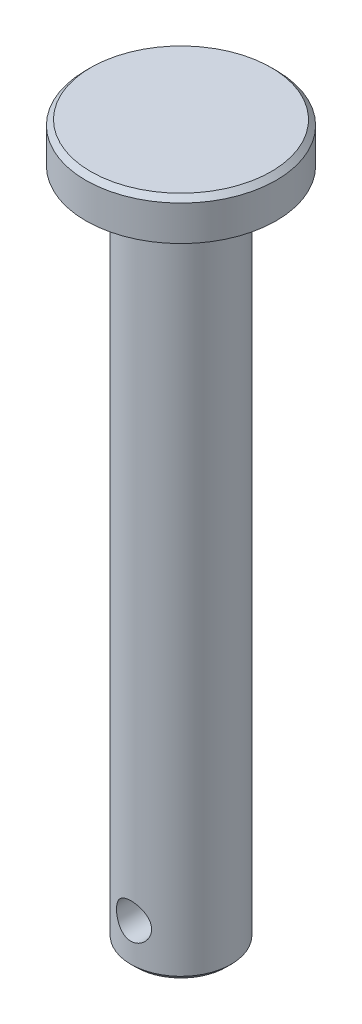
ISO-10303-21;
HEADER;
FILE_DESCRIPTION(('STEP AP214'),'2;1');
FILE_NAME('part.step','',(''),(''),'','','');
FILE_SCHEMA(('AUTOMOTIVE_DESIGN { 1 0 10303 214 1 1 1 1 }'));
ENDSEC;
DATA;
#1=APPLICATION_CONTEXT('core data for automotive mechanical design processes');
#2=APPLICATION_PROTOCOL_DEFINITION('international standard','automotive_design',2000,#1);
#3=PRODUCT_CONTEXT('',#1,'mechanical');
#4=PRODUCT('Part','Part','',(#3));
#5=PRODUCT_RELATED_PRODUCT_CATEGORY('part','',(#4));
#6=PRODUCT_DEFINITION_FORMATION('','',#4);
#7=PRODUCT_DEFINITION_CONTEXT('part definition',#1,'design');
#8=PRODUCT_DEFINITION('design','',#6,#7);
#9=PRODUCT_DEFINITION_SHAPE('','',#8);
#10=(LENGTH_UNIT() NAMED_UNIT(*) SI_UNIT(.MILLI.,.METRE.));
#11=(NAMED_UNIT(*) PLANE_ANGLE_UNIT() SI_UNIT($,.RADIAN.));
#12=(NAMED_UNIT(*) SI_UNIT($,.STERADIAN.) SOLID_ANGLE_UNIT());
#13=UNCERTAINTY_MEASURE_WITH_UNIT(LENGTH_MEASURE(1.E-05),#10,'distance_accuracy_value','');
#14=(GEOMETRIC_REPRESENTATION_CONTEXT(3) GLOBAL_UNCERTAINTY_ASSIGNED_CONTEXT((#13)) GLOBAL_UNIT_ASSIGNED_CONTEXT((#10,
#11,#12)) REPRESENTATION_CONTEXT('',''));
#15=CARTESIAN_POINT('',(0.,0.,0.));
#16=DIRECTION('',(0.,0.,1.));
#17=DIRECTION('',(1.,0.,0.));
#18=AXIS2_PLACEMENT_3D('',#15,#16,#17);
#19=CARTESIAN_POINT('',(0.,71.,0.));
#20=DIRECTION('',(0.,-1.,0.));
#21=DIRECTION('',(0.,0.,-1.));
#22=AXIS2_PLACEMENT_3D('',#19,#20,#21);
#23=PLANE('',#22);
#24=CARTESIAN_POINT('',(0.,71.,0.));
#25=DIRECTION('',(0.,1.,0.));
#26=DIRECTION('',(0.,0.,1.));
#27=AXIS2_PLACEMENT_3D('',#24,#25,#26);
#28=CIRCLE('',#27,18.);
#29=CARTESIAN_POINT('',(0.,71.,18.));
#30=VERTEX_POINT('',#29);
#31=EDGE_CURVE('E10',#30,#30,#28,.T.);
#32=ORIENTED_EDGE('',*,*,#31,.T.);
#33=EDGE_LOOP('',(#32));
#34=FACE_BOUND('',#33,.T.);
#35=ADVANCED_FACE('F37',(#34),#23,.F.);
#36=CARTESIAN_POINT('',(0.,70.,0.));
#37=DIRECTION('',(0.,-1.,0.));
#38=DIRECTION('',(0.,0.,-1.));
#39=AXIS2_PLACEMENT_3D('',#36,#37,#38);
#40=CONICAL_SURFACE('',#39,19.,0.785398163397455);
#41=ORIENTED_EDGE('',*,*,#31,.F.);
#42=EDGE_LOOP('',(#41));
#43=FACE_BOUND('',#42,.T.);
#44=CARTESIAN_POINT('',(0.,70.,0.));
#45=DIRECTION('',(0.,1.,0.));
#46=DIRECTION('',(0.,0.,1.));
#47=AXIS2_PLACEMENT_3D('',#44,#45,#46);
#48=CIRCLE('',#47,19.);
#49=CARTESIAN_POINT('',(0.,70.,19.));
#50=VERTEX_POINT('',#49);
#51=EDGE_CURVE('E49',#50,#50,#48,.T.);
#52=ORIENTED_EDGE('',*,*,#51,.T.);
#53=EDGE_LOOP('',(#52));
#54=FACE_BOUND('',#53,.T.);
#55=ADVANCED_FACE('F87',(#43,#54),#40,.T.);
#56=CARTESIAN_POINT('',(0.,71.,0.));
#57=DIRECTION('',(0.,1.,0.));
#58=DIRECTION('',(0.,0.,1.));
#59=AXIS2_PLACEMENT_3D('',#56,#57,#58);
#60=CYLINDRICAL_SURFACE('',#59,19.);
#61=ORIENTED_EDGE('',*,*,#51,.F.);
#62=EDGE_LOOP('',(#61));
#63=FACE_BOUND('',#62,.T.);
#64=CARTESIAN_POINT('',(0.,63.,0.));
#65=DIRECTION('',(0.,1.,0.));
#66=DIRECTION('',(0.,0.,1.));
#67=AXIS2_PLACEMENT_3D('',#64,#65,#66);
#68=CIRCLE('',#67,19.);
#69=CARTESIAN_POINT('',(0.,63.,19.));
#70=VERTEX_POINT('',#69);
#71=EDGE_CURVE('E54',#70,#70,#68,.T.);
#72=ORIENTED_EDGE('',*,*,#71,.T.);
#73=EDGE_LOOP('',(#72));
#74=FACE_BOUND('',#73,.T.);
#75=ADVANCED_FACE('F91',(#63,#74),#60,.T.);
#76=CARTESIAN_POINT('',(0.,63.,-19.));
#77=DIRECTION('',(0.,1.,0.));
#78=DIRECTION('',(0.,0.,1.));
#79=AXIS2_PLACEMENT_3D('',#76,#77,#78);
#80=PLANE('',#79);
#81=ORIENTED_EDGE('',*,*,#71,.F.);
#82=EDGE_LOOP('',(#81));
#83=FACE_BOUND('',#82,.T.);
#84=CARTESIAN_POINT('',(0.,63.,0.));
#85=DIRECTION('',(0.,1.,0.));
#86=DIRECTION('',(0.,0.,1.));
#87=AXIS2_PLACEMENT_3D('',#84,#85,#86);
#88=CIRCLE('',#87,9.99999999999998);
#89=CARTESIAN_POINT('',(0.,63.,9.99999999999997));
#90=VERTEX_POINT('',#89);
#91=EDGE_CURVE('E107',#90,#90,#88,.T.);
#92=ORIENTED_EDGE('',*,*,#91,.T.);
#93=EDGE_LOOP('',(#92));
#94=FACE_BOUND('',#93,.T.);
#95=ADVANCED_FACE('F82',(#83,#94),#80,.F.);
#96=CARTESIAN_POINT('',(0.,71.,0.));
#97=DIRECTION('',(0.,1.,0.));
#98=DIRECTION('',(0.,0.,1.));
#99=AXIS2_PLACEMENT_3D('',#96,#97,#98);
#100=CYLINDRICAL_SURFACE('',#99,9.99999999999999);
#101=CARTESIAN_POINT('',(0.,-66.,9.99999999999997));
#102=CARTESIAN_POINT('',(-0.190419365667704,-66.0000029566494,10.000002074662));
#103=CARTESIAN_POINT('',(-0.380817621605742,-65.9844103285946,9.99451197787142));
#104=CARTESIAN_POINT('',(-0.75597335916891,-65.9226662068378,9.97315454250191));
#105=CARTESIAN_POINT('',(-0.940730815616033,-65.8765145767548,9.95728715761049));
#106=CARTESIAN_POINT('',(-1.29914235601609,-65.755451061498,9.91689126922361));
#107=CARTESIAN_POINT('',(-1.47281549375809,-65.6805901702276,9.89237812863978));
#108=CARTESIAN_POINT('',(-1.80513664529484,-65.504474888736,9.83716899731451));
#109=CARTESIAN_POINT('',(-1.96378123246314,-65.4032144988767,9.8064716014795));
#110=CARTESIAN_POINT('',(-2.26752589205325,-65.1731714843493,9.74080617360302));
#111=CARTESIAN_POINT('',(-2.4119819647604,-65.0435700817775,9.70572841777003));
#112=CARTESIAN_POINT('',(-2.67761185151263,-64.7622633310526,9.63583394944017));
#113=CARTESIAN_POINT('',(-2.79877980873017,-64.610552439313,9.6010173047214));
#114=CARTESIAN_POINT('',(-3.01822956436078,-64.2833453504412,9.53435354213096));
#115=CARTESIAN_POINT('',(-3.11564633061597,-64.1072394415403,9.50263856119574));
#116=CARTESIAN_POINT('',(-3.27919932284536,-63.7398554097092,9.44745244346255));
#117=CARTESIAN_POINT('',(-3.34534622118705,-63.5485824893256,9.4239784947154));
#118=CARTESIAN_POINT('',(-3.442016393275,-63.1636569673167,9.38909436352037));
#119=CARTESIAN_POINT('',(-3.47375567154242,-62.9703481028578,9.37727382728345));
#120=CARTESIAN_POINT('',(-3.5045119777418,-62.5808148810861,9.36582571885874));
#121=CARTESIAN_POINT('',(-3.50354037655207,-62.3845915605982,9.36619390965383));
#122=CARTESIAN_POINT('',(-3.46984099899521,-62.0054505410864,9.37872426808733));
#123=CARTESIAN_POINT('',(-3.43873715098197,-61.8223650196226,9.39028330321837));
#124=CARTESIAN_POINT('',(-3.34831908308157,-61.4641975936172,9.42290004435311));
#125=CARTESIAN_POINT('',(-3.2890011577967,-61.2891167436529,9.44395899797682));
#126=CARTESIAN_POINT('',(-3.14284371093641,-60.9483876332511,9.49360610743062));
#127=CARTESIAN_POINT('',(-3.05554665446728,-60.7829544486595,9.52231799264174));
#128=CARTESIAN_POINT('',(-2.85622688502669,-60.4685880510071,9.58398812877149));
#129=CARTESIAN_POINT('',(-2.74419646122598,-60.3196600053538,9.61694770260494));
#130=CARTESIAN_POINT('',(-2.49093399518727,-60.0334567716329,9.68573241314922));
#131=CARTESIAN_POINT('',(-2.34838607842094,-59.8973567504519,9.72161293244869));
#132=CARTESIAN_POINT('',(-2.04205684725532,-59.6506701281103,9.79053740803574));
#133=CARTESIAN_POINT('',(-1.87827306050323,-59.5400865018292,9.82358103329668));
#134=CARTESIAN_POINT('',(-1.53143472911855,-59.346494008746,9.88362313366386));
#135=CARTESIAN_POINT('',(-1.34817380341042,-59.2638294375549,9.91054487994603));
#136=CARTESIAN_POINT('',(-0.969175142974263,-59.1308776931334,9.95474882353581));
#137=CARTESIAN_POINT('',(-0.773442238836896,-59.0805780672284,9.97203472796903));
#138=CARTESIAN_POINT('',(-0.384982043681422,-59.0159341865782,9.99439060162867));
#139=CARTESIAN_POINT('',(-0.192549298627004,-59.0000041934811,9.99999889165428));
#140=CARTESIAN_POINT('',(0.192296486438432,-58.9999958106579,10.0000011069648));
#141=CARTESIAN_POINT('',(0.38470952331625,-59.0159114114297,9.99439714808518));
#142=CARTESIAN_POINT('',(0.757512294713572,-59.0779053499036,9.97296032320397));
#143=CARTESIAN_POINT('',(0.938089527398882,-59.1229851377336,9.95746630824308));
#144=CARTESIAN_POINT('',(1.28902504417687,-59.2407538149005,9.91814590109249));
#145=CARTESIAN_POINT('',(1.45938200269866,-59.3134462766792,9.89431843077796));
#146=CARTESIAN_POINT('',(1.790306794606,-59.4865900886315,9.83990425287677));
#147=CARTESIAN_POINT('',(1.95047324127449,-59.5877539847035,9.80914873431525));
#148=CARTESIAN_POINT('',(2.25205778758365,-59.8141451795731,9.74433517467016));
#149=CARTESIAN_POINT('',(2.39346963572598,-59.9393804682239,9.71027603890406));
#150=CARTESIAN_POINT('',(2.66095315380392,-60.2178002016141,9.64050839724204));
#151=CARTESIAN_POINT('',(2.7858945116179,-60.3720741079768,9.60480315581243));
#152=CARTESIAN_POINT('',(3.00828742625727,-60.7001458993998,9.53749178690691));
#153=CARTESIAN_POINT('',(3.10573801857335,-60.8739444691809,9.50588580327386));
#154=CARTESIAN_POINT('',(3.27010981479248,-61.2366672902075,9.45060554949469));
#155=CARTESIAN_POINT('',(3.33703039732226,-61.4255918492183,9.42693144078759));
#156=CARTESIAN_POINT('',(3.43775166187451,-61.8130654538863,9.39067542064748));
#157=CARTESIAN_POINT('',(3.47156933803391,-62.0116095061532,9.3780878180351));
#158=CARTESIAN_POINT('',(3.50371939295706,-62.4006203215422,9.36612061036571));
#159=CARTESIAN_POINT('',(3.50394730780741,-62.5909102966854,9.3660354680114));
#160=CARTESIAN_POINT('',(3.47365100022854,-62.9686626231576,9.37731326834124));
#161=CARTESIAN_POINT('',(3.44312898727853,-63.1561251766635,9.3886753885035));
#162=CARTESIAN_POINT('',(3.35359653138477,-63.5185509587428,9.42101694008898));
#163=CARTESIAN_POINT('',(3.29526105722089,-63.6937029666805,9.44176794542045));
#164=CARTESIAN_POINT('',(3.15232119578642,-64.0318580948069,9.49044489662162));
#165=CARTESIAN_POINT('',(3.0677106267727,-64.1948583448482,9.51837253067018));
#166=CARTESIAN_POINT('',(2.86997020698607,-64.5124345753923,9.57989875691139));
#167=CARTESIAN_POINT('',(2.75568240723705,-64.6662494002015,9.61370284993342));
#168=CARTESIAN_POINT('',(2.50372401134065,-64.9531276286835,9.68237561466641));
#169=CARTESIAN_POINT('',(2.36604648644048,-65.086184860852,9.71724459931304));
#170=CARTESIAN_POINT('',(2.06385316503681,-65.333783781714,9.78598669527178));
#171=CARTESIAN_POINT('',(1.89841397862824,-65.4472344505094,9.81974595569708));
#172=CARTESIAN_POINT('',(1.54966762908333,-65.6446234952796,9.88078026171567));
#173=CARTESIAN_POINT('',(1.36636283652995,-65.7285657799237,9.90805616593675));
#174=CARTESIAN_POINT('',(0.989029837726606,-65.8632572190412,9.95276281016495));
#175=CARTESIAN_POINT('',(0.795139546253175,-65.9143566085701,9.97029715080658));
#176=CARTESIAN_POINT('',(0.400823491605337,-65.9827204850051,9.99391263716037));
#177=CARTESIAN_POINT('',(0.200400055490112,-65.99999688838,9.99999781659607));
#178=CARTESIAN_POINT('',(0.,-66.,9.99999999999997));
#179=B_SPLINE_CURVE_WITH_KNOTS('',3,(#101,#102,#103,#104,#105,#106,#107,#108,#109,#110,#111,
#112,#113,#114,#115,#116,#117,#118,#119,#120,#121,#122,#123,#124,#125,#126,#127,#128,#129,#130,
#131,#132,#133,#134,#135,#136,#137,#138,#139,#140,#141,#142,#143,#144,#145,#146,#147,#148,#149,
#150,#151,#152,#153,#154,#155,#156,#157,#158,#159,#160,#161,#162,#163,#164,#165,#166,#167,#168,
#169,#170,#171,#172,#173,#174,#175,#176,#177,#178),.UNSPECIFIED.,.T.,.F.,(4,2,2,2,2,2,2,2,2,2,2,
2,2,2,2,2,2,2,2,2,2,2,2,2,2,2,2,2,2,2,2,2,2,2,2,2,2,2,4),(0.,0.570519944031419,1.14104243423655,
1.71055621088201,2.28019953012127,2.86921290102947,3.45837421214187,4.06655384480434,
4.67452575637786,5.26023033916309,5.84573132281353,6.40133800538016,6.95701767677413,
7.52229238004191,8.08774356179834,8.68595781382782,9.28424177465472,9.88965514245498,
10.4948354330496,11.0714375543579,11.6479308767879,12.2056613710878,12.7634640474099,
13.336703777142,13.9101341080364,14.5124257563886,15.1147385334242,15.7170635687055,
16.319079224177,16.8871081579754,17.4550962800157,18.0099524936405,18.5649393473461,
19.1461307089424,19.7274945383823,20.3347978040911,20.9420205963009,21.542655573071,
22.1430788968291),.UNSPECIFIED.);
#180=CARTESIAN_POINT('',(0.,-66.,9.99999999999997));
#181=VERTEX_POINT('',#180);
#182=EDGE_CURVE('E40',#181,#181,#179,.T.);
#183=ORIENTED_EDGE('',*,*,#182,.T.);
#184=EDGE_LOOP('',(#183));
#185=FACE_BOUND('',#184,.T.);
#186=CARTESIAN_POINT('',(3.5,-62.5,-9.3674969975976));
#187=CARTESIAN_POINT('',(3.50000305653412,-62.3099847715568,-9.36749440971919));
#188=CARTESIAN_POINT('',(3.48447405691784,-62.1199908337182,-9.37334161385506));
#189=CARTESIAN_POINT('',(3.42300568686183,-61.745670773122,-9.3959610792646));
#190=CARTESIAN_POINT('',(3.37706378968547,-61.5613451226235,-9.41273424827747));
#191=CARTESIAN_POINT('',(3.25661257103421,-61.2038533163906,-9.45507797616443));
#192=CARTESIAN_POINT('',(3.18216395043216,-61.0306643556949,-9.48062983032267));
#193=CARTESIAN_POINT('',(3.00702321848338,-60.6991732325953,-9.53762356429099));
#194=CARTESIAN_POINT('',(2.90632443475546,-60.5408748690902,-9.56906694106175));
#195=CARTESIAN_POINT('',(2.67688293965062,-60.2368213832174,-9.63582342492187));
#196=CARTESIAN_POINT('',(2.54719487518731,-60.0918021561627,-9.67123996185276));
#197=CARTESIAN_POINT('',(2.26546916251154,-59.8250625059667,-9.74108253834275));
#198=CARTESIAN_POINT('',(2.11342750418821,-59.7033462722917,-9.77550839885223));
#199=CARTESIAN_POINT('',(1.78585018605226,-59.4832498710801,-9.84070055714599));
#200=CARTESIAN_POINT('',(1.60975957407365,-59.3856519099238,-9.87133119900492));
#201=CARTESIAN_POINT('',(1.2424014342135,-59.2217603822514,-9.92425360244259));
#202=CARTESIAN_POINT('',(1.05113846528144,-59.1554574535921,-9.94654785749863));
#203=CARTESIAN_POINT('',(0.666588882256228,-59.0585664225236,-9.97955234395668));
#204=CARTESIAN_POINT('',(0.473656238100813,-59.0267152549479,-9.99067110510591));
#205=CARTESIAN_POINT('',(0.0848856021438209,-58.9956038246808,-10.0015281495066));
#206=CARTESIAN_POINT('',(-0.110951549876001,-58.9963343184449,-10.0012696605286));
#207=CARTESIAN_POINT('',(-0.490988541369923,-59.0295896163455,-9.98967164690015));
#208=CARTESIAN_POINT('',(-0.675325714390917,-59.0607400303382,-9.97881113553875));
#209=CARTESIAN_POINT('',(-1.03596846192583,-59.1516630279226,-9.9478411735745));
#210=CARTESIAN_POINT('',(-1.21227347889997,-59.211437595111,-9.92773108199803));
#211=CARTESIAN_POINT('',(-1.55471483181771,-59.3586493032111,-9.87993869693849));
#212=CARTESIAN_POINT('',(-1.72067758348,-59.4464562520019,-9.85215588578904));
#213=CARTESIAN_POINT('',(-2.03590117401331,-59.646927453325,-9.79187924104223));
#214=CARTESIAN_POINT('',(-2.18515703205791,-59.7595990891748,-9.75938400912388));
#215=CARTESIAN_POINT('',(-2.47087991906561,-60.013412146894,-9.69110123269399));
#216=CARTESIAN_POINT('',(-2.60629061174075,-60.1557220350269,-9.65523032328996));
#217=CARTESIAN_POINT('',(-2.85168878385786,-60.4613039837822,-9.58562363211351));
#218=CARTESIAN_POINT('',(-2.9616714639053,-60.6245799926114,-9.55188825428183));
#219=CARTESIAN_POINT('',(-3.15476153205294,-60.9711200690638,-9.48988823258127));
#220=CARTESIAN_POINT('',(-3.23737626942264,-61.1546786228084,-9.46172720245545));
#221=CARTESIAN_POINT('',(-3.37014757433805,-61.5343413483014,-9.41525954321772));
#222=CARTESIAN_POINT('',(-3.42031943737438,-61.7304395601225,-9.3969482710328));
#223=CARTESIAN_POINT('',(-3.48453330621147,-62.1192967496137,-9.37332105969714));
#224=CARTESIAN_POINT('',(-3.50022937268545,-62.311746397617,-9.36741082166473));
#225=CARTESIAN_POINT('',(-3.49976567675266,-62.6965791604997,-9.36758502312181));
#226=CARTESIAN_POINT('',(-3.48361248881526,-62.8889622809129,-9.37366698712589));
#227=CARTESIAN_POINT('',(-3.42140083953763,-63.260318118364,-9.39654335530695));
#228=CARTESIAN_POINT('',(-3.37654009447338,-63.4395208669268,-9.41290826782188));
#229=CARTESIAN_POINT('',(-3.25965068720098,-63.7878030689567,-9.45401972645323));
#230=CARTESIAN_POINT('',(-3.18761690701554,-63.9568806084088,-9.47876785143836));
#231=CARTESIAN_POINT('',(-3.01564515483387,-64.2865094441706,-9.53489951676246));
#232=CARTESIAN_POINT('',(-2.91483956950775,-64.4465735283704,-9.56648051339459));
#233=CARTESIAN_POINT('',(-2.68914500633046,-64.7481084485638,-9.63235686963823));
#234=CARTESIAN_POINT('',(-2.56424824219257,-64.88957324833,-9.66665310469827));
#235=CARTESIAN_POINT('',(-2.28593247448553,-65.1577872854242,-9.73633119025962));
#236=CARTESIAN_POINT('',(-2.13133888493012,-65.2833321926444,-9.77167190229907));
#237=CARTESIAN_POINT('',(-1.80240593612249,-65.5068018026585,-9.83765372828227));
#238=CARTESIAN_POINT('',(-1.62806703575054,-65.6047271471455,-9.86829495140302));
#239=CARTESIAN_POINT('',(-1.26521616343171,-65.7693542608884,-9.92132136236446));
#240=CARTESIAN_POINT('',(-1.0767900453662,-65.836229710326,-9.94375232187575));
#241=CARTESIAN_POINT('',(-0.690414750069385,-65.9370255809677,-9.97801936827267));
#242=CARTESIAN_POINT('',(-0.492469439318241,-65.9709592656754,-9.98985971915569));
#243=CARTESIAN_POINT('',(-0.103636883752359,-66.0036204126036,-10.0012572973375));
#244=CARTESIAN_POINT('',(0.0870896347606734,-66.0040691284722,-10.0014150508395));
#245=CARTESIAN_POINT('',(0.465775073928696,-65.9740639037525,-9.99094200420206));
#246=CARTESIAN_POINT('',(0.653734257414445,-65.9436129173581,-9.98031223541338));
#247=CARTESIAN_POINT('',(1.01796363940983,-65.8538453081339,-9.94970123167975));
#248=CARTESIAN_POINT('',(1.19438805946025,-65.795088020167,-9.92990147780882));
#249=CARTESIAN_POINT('',(1.53492402713973,-65.6509072901555,-9.8829947150704));
#250=CARTESIAN_POINT('',(1.69903327861285,-65.5654788905445,-9.85588634782217));
#251=CARTESIAN_POINT('',(2.01730058632863,-65.3665456170382,-9.79580321695775));
#252=CARTESIAN_POINT('',(2.17081712673075,-65.25207211901,-9.76264026908024));
#253=CARTESIAN_POINT('',(2.45701356107972,-64.9998973343736,-9.69457389820949));
#254=CARTESIAN_POINT('',(2.58968644353592,-64.8621882638404,-9.65966989473118));
#255=CARTESIAN_POINT('',(2.83644297052622,-64.5601629097853,-9.5901912159067));
#256=CARTESIAN_POINT('',(2.9494409602868,-64.3949373339131,-9.55569982961205));
#257=CARTESIAN_POINT('',(3.1460305199825,-64.0467522856836,-9.49279689390618));
#258=CARTESIAN_POINT('',(3.22962589570285,-63.8637951123638,-9.46438455782774));
#259=CARTESIAN_POINT('',(3.36376834113852,-63.4871957030619,-9.41754204054603));
#260=CARTESIAN_POINT('',(3.41467143953433,-63.2936943734507,-9.39900471032415));
#261=CARTESIAN_POINT('',(3.48277809330472,-62.9001188346738,-9.37398625810593));
#262=CARTESIAN_POINT('',(3.49999678208754,-62.7000476182622,-9.36749972211036));
#263=CARTESIAN_POINT('',(3.5,-62.5,-9.3674969975976));
#264=B_SPLINE_CURVE_WITH_KNOTS('',3,(#186,#187,#188,#189,#190,#191,#192,#193,#194,#195,#196,
#197,#198,#199,#200,#201,#202,#203,#204,#205,#206,#207,#208,#209,#210,#211,#212,#213,#214,#215,
#216,#217,#218,#219,#220,#221,#222,#223,#224,#225,#226,#227,#228,#229,#230,#231,#232,#233,#234,
#235,#236,#237,#238,#239,#240,#241,#242,#243,#244,#245,#246,#247,#248,#249,#250,#251,#252,#253,
#254,#255,#256,#257,#258,#259,#260,#261,#262,#263),.UNSPECIFIED.,.T.,.F.,(4,2,2,2,2,2,2,2,2,2,2,
2,2,2,2,2,2,2,2,2,2,2,2,2,2,2,2,2,2,2,2,2,2,2,2,2,2,2,4),(0.,0.569303271188394,1.13865384664941,
1.7067987558077,2.27508821957677,2.86567632067938,3.45637049958399,4.06425497293887,
4.671957477662,5.25653473089017,5.84094613832785,6.40011991303918,6.95933244298441,
7.52625023609967,8.09333659677847,8.6896650990417,9.28610606324158,9.89276413906807,
10.499135991446,11.0757147838072,11.6521745685868,12.2060258875446,12.7599815752237,
13.3328233448281,13.9058505684788,14.5097673315547,15.1136700625062,15.7141528622371,
16.3143937862434,16.8837576246019,17.4530670335451,18.0115615554683,18.5701599509704,
19.1506370908609,19.7313090782975,20.3377389331389,20.9440902646265,21.5437209656749,
22.1430822084723),.UNSPECIFIED.);
#265=CARTESIAN_POINT('',(3.5,-62.5,-9.3674969975976));
#266=VERTEX_POINT('',#265);
#267=EDGE_CURVE('E57',#266,#266,#264,.T.);
#268=ORIENTED_EDGE('',*,*,#267,.T.);
#269=EDGE_LOOP('',(#268));
#270=FACE_BOUND('',#269,.T.);
#271=ORIENTED_EDGE('',*,*,#91,.F.);
#272=EDGE_LOOP('',(#271));
#273=FACE_BOUND('',#272,.T.);
#274=CARTESIAN_POINT('',(0.,-70.,0.));
#275=DIRECTION('',(0.,1.,0.));
#276=DIRECTION('',(0.,0.,1.));
#277=AXIS2_PLACEMENT_3D('',#274,#275,#276);
#278=CIRCLE('',#277,10.);
#279=CARTESIAN_POINT('',(0.,-70.,9.99999999999998));
#280=VERTEX_POINT('',#279);
#281=EDGE_CURVE('E109',#280,#280,#278,.T.);
#282=ORIENTED_EDGE('',*,*,#281,.T.);
#283=EDGE_LOOP('',(#282));
#284=FACE_BOUND('',#283,.T.);
#285=ADVANCED_FACE('F62',(#185,#270,#273,#284),#100,.T.);
#286=CARTESIAN_POINT('',(0.,-71.,0.));
#287=DIRECTION('',(0.,1.,0.));
#288=DIRECTION('',(0.,0.,1.));
#289=AXIS2_PLACEMENT_3D('',#286,#287,#288);
#290=CONICAL_SURFACE('',#289,9.,0.785398163397447);
#291=ORIENTED_EDGE('',*,*,#281,.F.);
#292=EDGE_LOOP('',(#291));
#293=FACE_BOUND('',#292,.T.);
#294=CARTESIAN_POINT('',(0.,-71.,0.));
#295=DIRECTION('',(0.,1.,0.));
#296=DIRECTION('',(0.,0.,1.));
#297=AXIS2_PLACEMENT_3D('',#294,#295,#296);
#298=CIRCLE('',#297,9.);
#299=CARTESIAN_POINT('',(0.,-71.,8.99999999999998));
#300=VERTEX_POINT('',#299);
#301=EDGE_CURVE('E112',#300,#300,#298,.T.);
#302=ORIENTED_EDGE('',*,*,#301,.T.);
#303=EDGE_LOOP('',(#302));
#304=FACE_BOUND('',#303,.T.);
#305=ADVANCED_FACE('F74',(#293,#304),#290,.T.);
#306=CARTESIAN_POINT('',(0.,-71.,-9.00000000000001));
#307=DIRECTION('',(0.,1.,0.));
#308=DIRECTION('',(0.,0.,1.));
#309=AXIS2_PLACEMENT_3D('',#306,#307,#308);
#310=PLANE('',#309);
#311=ORIENTED_EDGE('',*,*,#301,.F.);
#312=EDGE_LOOP('',(#311));
#313=FACE_BOUND('',#312,.T.);
#314=ADVANCED_FACE('F70',(#313),#310,.F.);
#315=CARTESIAN_POINT('',(0.,-62.5,-19.));
#316=DIRECTION('',(0.,0.,1.));
#317=DIRECTION('',(1.,0.,0.));
#318=AXIS2_PLACEMENT_3D('',#315,#316,#317);
#319=CYLINDRICAL_SURFACE('',#318,3.5);
#320=ORIENTED_EDGE('',*,*,#267,.F.);
#321=EDGE_LOOP('',(#320));
#322=FACE_BOUND('',#321,.T.);
#323=ORIENTED_EDGE('',*,*,#182,.F.);
#324=EDGE_LOOP('',(#323));
#325=FACE_BOUND('',#324,.T.);
#326=ADVANCED_FACE('F66',(#322,#325),#319,.F.);
#327=CLOSED_SHELL('',(#35,#55,#75,#95,#285,#305,#314,#326));
#328=MANIFOLD_SOLID_BREP('B2',#327);
#329=ADVANCED_BREP_SHAPE_REPRESENTATION('',(#18,#328),#14);
#330=SHAPE_DEFINITION_REPRESENTATION(#9,#329);
ENDSEC;
END-ISO-10303-21;
